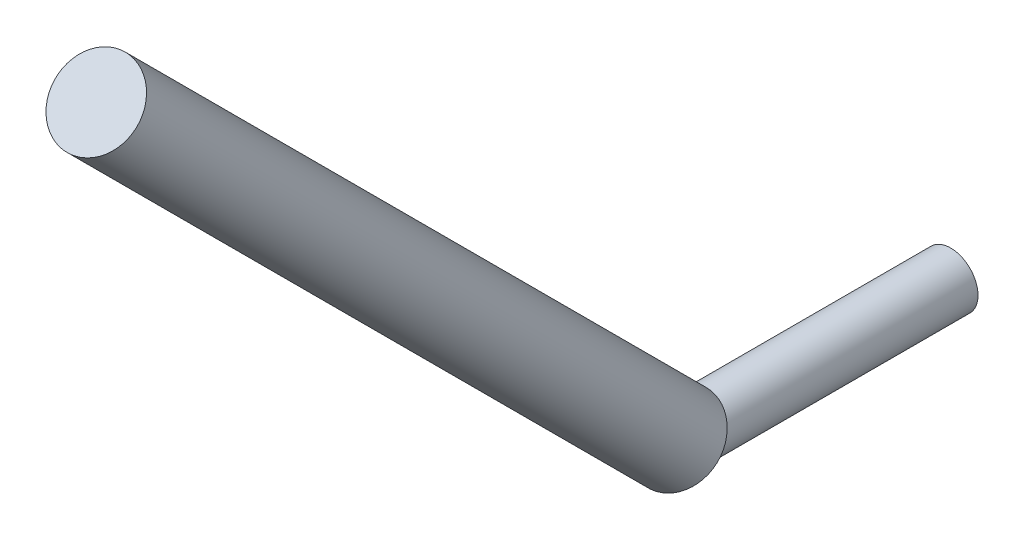
ISO-10303-21;
HEADER;
FILE_DESCRIPTION(('STEP AP214'),'2;1');
FILE_NAME('part.step','',(''),(''),'','','');
FILE_SCHEMA(('AUTOMOTIVE_DESIGN { 1 0 10303 214 1 1 1 1 }'));
ENDSEC;
DATA;
#1=APPLICATION_CONTEXT('core data for automotive mechanical design processes');
#2=APPLICATION_PROTOCOL_DEFINITION('international standard','automotive_design',2000,#1);
#3=PRODUCT_CONTEXT('',#1,'mechanical');
#4=PRODUCT('Part','Part','',(#3));
#5=PRODUCT_RELATED_PRODUCT_CATEGORY('part','',(#4));
#6=PRODUCT_DEFINITION_FORMATION('','',#4);
#7=PRODUCT_DEFINITION_CONTEXT('part definition',#1,'design');
#8=PRODUCT_DEFINITION('design','',#6,#7);
#9=PRODUCT_DEFINITION_SHAPE('','',#8);
#10=(LENGTH_UNIT() NAMED_UNIT(*) SI_UNIT(.MILLI.,.METRE.));
#11=(NAMED_UNIT(*) PLANE_ANGLE_UNIT() SI_UNIT($,.RADIAN.));
#12=(NAMED_UNIT(*) SI_UNIT($,.STERADIAN.) SOLID_ANGLE_UNIT());
#13=UNCERTAINTY_MEASURE_WITH_UNIT(LENGTH_MEASURE(1.E-05),#10,'distance_accuracy_value','');
#14=(GEOMETRIC_REPRESENTATION_CONTEXT(3) GLOBAL_UNCERTAINTY_ASSIGNED_CONTEXT((#13)) GLOBAL_UNIT_ASSIGNED_CONTEXT((#10,
#11,#12)) REPRESENTATION_CONTEXT('',''));
#15=CARTESIAN_POINT('',(0.,0.,0.));
#16=DIRECTION('',(0.,0.,1.));
#17=DIRECTION('',(1.,0.,0.));
#18=AXIS2_PLACEMENT_3D('',#15,#16,#17);
#19=CARTESIAN_POINT('',(0.,0.,-20.));
#20=DIRECTION('',(0.,0.,1.));
#21=DIRECTION('',(1.,0.,0.));
#22=AXIS2_PLACEMENT_3D('',#19,#20,#21);
#23=CYLINDRICAL_SURFACE('',#22,2.);
#24=CARTESIAN_POINT('',(0.,0.,0.));
#25=DIRECTION('',(0.,-0.707106781186549,-0.707106781186546));
#26=DIRECTION('',(0.,-0.707106781186546,0.707106781186549));
#27=AXIS2_PLACEMENT_3D('',#24,#25,#26);
#28=ELLIPSE('',#27,2.82842712474619,2.);
#29=CARTESIAN_POINT('',(2.,0.,0.));
#30=VERTEX_POINT('',#29);
#31=CARTESIAN_POINT('',(-2.,0.,0.));
#32=VERTEX_POINT('',#31);
#33=EDGE_CURVE('E51',#30,#32,#28,.F.);
#34=ORIENTED_EDGE('',*,*,#33,.F.);
#35=CARTESIAN_POINT('',(0.,0.,0.));
#36=DIRECTION('',(0.,0.,1.));
#37=DIRECTION('',(1.,0.,0.));
#38=AXIS2_PLACEMENT_3D('',#35,#36,#37);
#39=CIRCLE('',#38,2.);
#40=EDGE_CURVE('E46',#32,#30,#39,.T.);
#41=ORIENTED_EDGE('',*,*,#40,.F.);
#42=EDGE_LOOP('',(#34,#41));
#43=FACE_BOUND('',#42,.T.);
#44=CARTESIAN_POINT('',(0.,0.,-20.));
#45=DIRECTION('',(0.,0.,1.));
#46=DIRECTION('',(1.,0.,0.));
#47=AXIS2_PLACEMENT_3D('',#44,#45,#46);
#48=CIRCLE('',#47,2.);
#49=CARTESIAN_POINT('',(2.,0.,-20.));
#50=VERTEX_POINT('',#49);
#51=EDGE_CURVE('E40',#50,#50,#48,.T.);
#52=ORIENTED_EDGE('',*,*,#51,.T.);
#53=EDGE_LOOP('',(#52));
#54=FACE_BOUND('',#53,.T.);
#55=ADVANCED_FACE('F33',(#43,#54),#23,.T.);
#56=CARTESIAN_POINT('',(0.,0.,-20.));
#57=DIRECTION('',(0.,0.,1.));
#58=DIRECTION('',(1.,0.,0.));
#59=AXIS2_PLACEMENT_3D('',#56,#57,#58);
#60=PLANE('',#59);
#61=ORIENTED_EDGE('',*,*,#51,.F.);
#62=EDGE_LOOP('',(#61));
#63=FACE_BOUND('',#62,.T.);
#64=ADVANCED_FACE('F72',(#63),#60,.F.);
#65=CARTESIAN_POINT('',(0.,0.,0.));
#66=DIRECTION('',(0.,0.,1.));
#67=DIRECTION('',(1.,0.,0.));
#68=AXIS2_PLACEMENT_3D('',#65,#66,#67);
#69=PLANE('',#68);
#70=DIRECTION('',(1.,0.,0.));
#71=VECTOR('',#70,1.);
#72=CARTESIAN_POINT('',(0.,0.,0.));
#73=LINE('',#72,#71);
#74=EDGE_CURVE('E11',#32,#30,#73,.T.);
#75=ORIENTED_EDGE('',*,*,#74,.F.);
#76=ORIENTED_EDGE('',*,*,#40,.T.);
#77=EDGE_LOOP('',(#75,#76));
#78=FACE_BOUND('',#77,.T.);
#79=ADVANCED_FACE('F48',(#78),#69,.T.);
#80=CARTESIAN_POINT('',(0.,0.,0.));
#81=DIRECTION('',(0.,-0.707106781186549,-0.707106781186546));
#82=DIRECTION('',(0.,0.707106781186546,-0.707106781186549));
#83=AXIS2_PLACEMENT_3D('',#80,#81,#82);
#84=PLANE('',#83);
#85=ORIENTED_EDGE('',*,*,#74,.T.);
#86=ORIENTED_EDGE('',*,*,#33,.T.);
#87=EDGE_LOOP('',(#85,#86));
#88=FACE_BOUND('',#87,.T.);
#89=CARTESIAN_POINT('',(0.,0.,0.));
#90=DIRECTION('',(0.,-0.707106781186549,-0.707106781186546));
#91=DIRECTION('',(0.,0.707106781186546,-0.707106781186549));
#92=AXIS2_PLACEMENT_3D('',#89,#90,#91);
#93=CIRCLE('',#92,3.);
#94=CARTESIAN_POINT('',(0.,2.12132034355964,-2.12132034355965));
#95=VERTEX_POINT('',#94);
#96=EDGE_CURVE('E54',#95,#95,#93,.T.);
#97=ORIENTED_EDGE('',*,*,#96,.T.);
#98=EDGE_LOOP('',(#97));
#99=FACE_BOUND('',#98,.T.);
#100=ADVANCED_FACE('F56',(#88,#99),#84,.T.);
#101=CARTESIAN_POINT('',(0.,0.,0.));
#102=DIRECTION('',(0.,-0.707106781186549,-0.707106781186546));
#103=DIRECTION('',(0.,0.707106781186546,-0.707106781186549));
#104=AXIS2_PLACEMENT_3D('',#101,#102,#103);
#105=CYLINDRICAL_SURFACE('',#104,3.);
#106=CARTESIAN_POINT('',(0.,42.4264068711929,42.4264068711928));
#107=DIRECTION('',(0.,-0.707106781186549,-0.707106781186546));
#108=DIRECTION('',(0.,0.707106781186546,-0.707106781186549));
#109=AXIS2_PLACEMENT_3D('',#106,#107,#108);
#110=CIRCLE('',#109,3.);
#111=CARTESIAN_POINT('',(0.,44.5477272147526,40.3050865276331));
#112=VERTEX_POINT('',#111);
#113=EDGE_CURVE('E64',#112,#112,#110,.T.);
#114=ORIENTED_EDGE('',*,*,#113,.T.);
#115=EDGE_LOOP('',(#114));
#116=FACE_BOUND('',#115,.T.);
#117=ORIENTED_EDGE('',*,*,#96,.F.);
#118=EDGE_LOOP('',(#117));
#119=FACE_BOUND('',#118,.T.);
#120=ADVANCED_FACE('F59',(#116,#119),#105,.T.);
#121=CARTESIAN_POINT('',(0.,44.5477272147526,40.3050865276331));
#122=DIRECTION('',(0.,0.707106781186549,0.707106781186546));
#123=DIRECTION('',(0.,-0.707106781186546,0.707106781186549));
#124=AXIS2_PLACEMENT_3D('',#121,#122,#123);
#125=PLANE('',#124);
#126=ORIENTED_EDGE('',*,*,#113,.F.);
#127=EDGE_LOOP('',(#126));
#128=FACE_BOUND('',#127,.T.);
#129=ADVANCED_FACE('F82',(#128),#125,.T.);
#130=CLOSED_SHELL('',(#55,#64,#79,#100,#120,#129));
#131=MANIFOLD_SOLID_BREP('B2',#130);
#132=ADVANCED_BREP_SHAPE_REPRESENTATION('',(#18,#131),#14);
#133=SHAPE_DEFINITION_REPRESENTATION(#9,#132);
ENDSEC;
END-ISO-10303-21;
